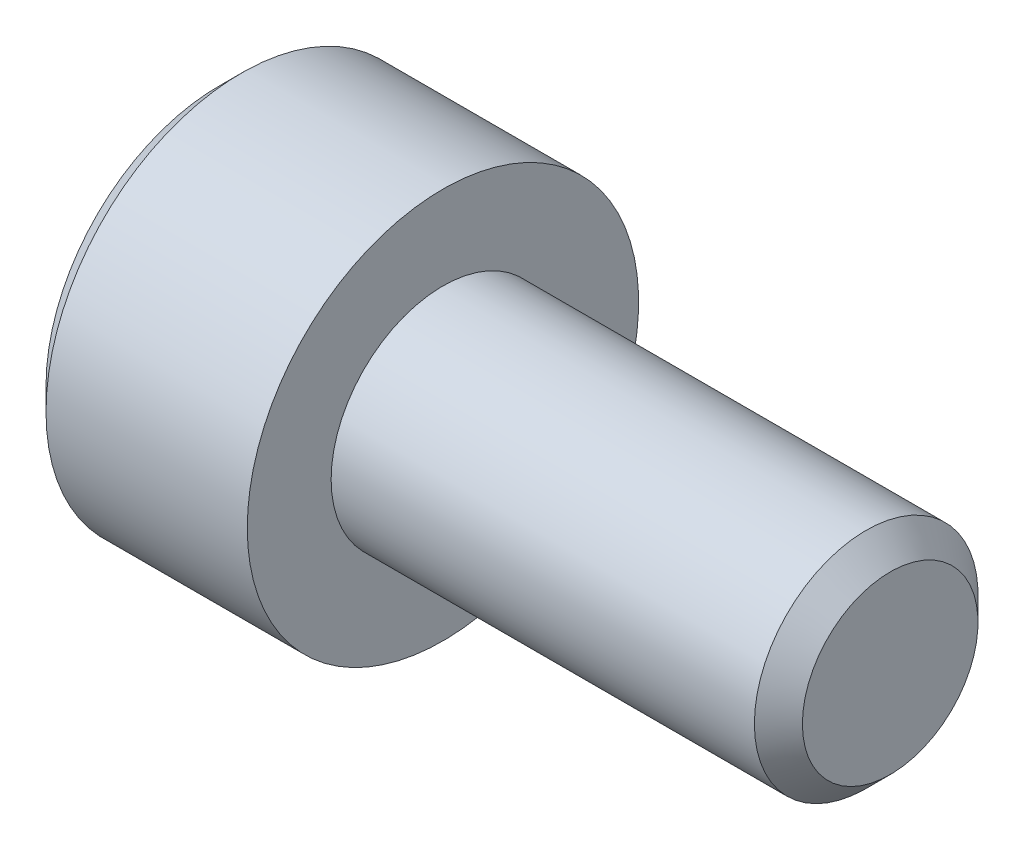
ISO-10303-21;
HEADER;
FILE_DESCRIPTION(('STEP AP214'),'2;1');
FILE_NAME('part.step','',(''),(''),'','','');
FILE_SCHEMA(('AUTOMOTIVE_DESIGN { 1 0 10303 214 1 1 1 1 }'));
ENDSEC;
DATA;
#1=APPLICATION_CONTEXT('core data for automotive mechanical design processes');
#2=APPLICATION_PROTOCOL_DEFINITION('international standard','automotive_design',2000,#1);
#3=PRODUCT_CONTEXT('',#1,'mechanical');
#4=PRODUCT('Part','Part','',(#3));
#5=PRODUCT_RELATED_PRODUCT_CATEGORY('part','',(#4));
#6=PRODUCT_DEFINITION_FORMATION('','',#4);
#7=PRODUCT_DEFINITION_CONTEXT('part definition',#1,'design');
#8=PRODUCT_DEFINITION('design','',#6,#7);
#9=PRODUCT_DEFINITION_SHAPE('','',#8);
#10=(LENGTH_UNIT() NAMED_UNIT(*) SI_UNIT(.MILLI.,.METRE.));
#11=(NAMED_UNIT(*) PLANE_ANGLE_UNIT() SI_UNIT($,.RADIAN.));
#12=(NAMED_UNIT(*) SI_UNIT($,.STERADIAN.) SOLID_ANGLE_UNIT());
#13=UNCERTAINTY_MEASURE_WITH_UNIT(LENGTH_MEASURE(1.E-05),#10,'distance_accuracy_value','');
#14=(GEOMETRIC_REPRESENTATION_CONTEXT(3) GLOBAL_UNCERTAINTY_ASSIGNED_CONTEXT((#13)) GLOBAL_UNIT_ASSIGNED_CONTEXT((#10,
#11,#12)) REPRESENTATION_CONTEXT('',''));
#15=CARTESIAN_POINT('',(0.,0.,0.));
#16=DIRECTION('',(0.,0.,1.));
#17=DIRECTION('',(1.,0.,0.));
#18=AXIS2_PLACEMENT_3D('',#15,#16,#17);
#19=CARTESIAN_POINT('',(-4.,-3.10000000000001,0.));
#20=DIRECTION('',(-1.,0.,0.));
#21=DIRECTION('',(0.,0.,1.));
#22=AXIS2_PLACEMENT_3D('',#19,#20,#21);
#23=PLANE('',#22);
#24=DIRECTION('',(0.,0.5,-0.866025403784439));
#25=VECTOR('',#24,1.);
#26=CARTESIAN_POINT('',(-4.,0.866025403784439,1.5));
#27=LINE('',#26,#25);
#28=CARTESIAN_POINT('',(-4.,0.866025403784439,1.5));
#29=VERTEX_POINT('',#28);
#30=CARTESIAN_POINT('',(-4.,1.73205080756888,0.));
#31=VERTEX_POINT('',#30);
#32=EDGE_CURVE('E59',#29,#31,#27,.T.);
#33=ORIENTED_EDGE('',*,*,#32,.F.);
#34=DIRECTION('',(0.,1.,0.));
#35=VECTOR('',#34,1.);
#36=CARTESIAN_POINT('',(-4.,-0.86602540378444,1.5));
#37=LINE('',#36,#35);
#38=CARTESIAN_POINT('',(-4.,-0.86602540378444,1.5));
#39=VERTEX_POINT('',#38);
#40=EDGE_CURVE('E142',#39,#29,#37,.T.);
#41=ORIENTED_EDGE('',*,*,#40,.F.);
#42=DIRECTION('',(0.,0.5,0.866025403784439));
#43=VECTOR('',#42,1.);
#44=CARTESIAN_POINT('',(-4.,-1.73205080756888,0.));
#45=LINE('',#44,#43);
#46=CARTESIAN_POINT('',(-4.,-1.73205080756888,0.));
#47=VERTEX_POINT('',#46);
#48=EDGE_CURVE('E140',#47,#39,#45,.T.);
#49=ORIENTED_EDGE('',*,*,#48,.F.);
#50=DIRECTION('',(0.,-0.5,0.866025403784439));
#51=VECTOR('',#50,1.);
#52=CARTESIAN_POINT('',(-4.,-0.866025403784439,-1.5));
#53=LINE('',#52,#51);
#54=CARTESIAN_POINT('',(-4.,-0.866025403784439,-1.5));
#55=VERTEX_POINT('',#54);
#56=EDGE_CURVE('E107',#55,#47,#53,.T.);
#57=ORIENTED_EDGE('',*,*,#56,.F.);
#58=DIRECTION('',(0.,-1.,0.));
#59=VECTOR('',#58,1.);
#60=CARTESIAN_POINT('',(-4.,0.866025403784439,-1.5));
#61=LINE('',#60,#59);
#62=CARTESIAN_POINT('',(-4.,0.866025403784439,-1.5));
#63=VERTEX_POINT('',#62);
#64=EDGE_CURVE('E136',#63,#55,#61,.T.);
#65=ORIENTED_EDGE('',*,*,#64,.F.);
#66=DIRECTION('',(0.,-0.5,-0.866025403784439));
#67=VECTOR('',#66,1.);
#68=CARTESIAN_POINT('',(-4.,1.73205080756888,0.));
#69=LINE('',#68,#67);
#70=EDGE_CURVE('E133',#31,#63,#69,.T.);
#71=ORIENTED_EDGE('',*,*,#70,.F.);
#72=EDGE_LOOP('',(#33,#41,#49,#57,#65,#71));
#73=FACE_BOUND('',#72,.T.);
#74=CARTESIAN_POINT('',(-4.,0.,0.));
#75=DIRECTION('',(-1.,0.,0.));
#76=DIRECTION('',(0.,0.,1.));
#77=AXIS2_PLACEMENT_3D('',#74,#75,#76);
#78=CIRCLE('',#77,3.10000000000001);
#79=CARTESIAN_POINT('',(-4.,0.,3.10000000000001));
#80=VERTEX_POINT('',#79);
#81=EDGE_CURVE('E146',#80,#80,#78,.T.);
#82=ORIENTED_EDGE('',*,*,#81,.T.);
#83=EDGE_LOOP('',(#82));
#84=FACE_BOUND('',#83,.T.);
#85=ADVANCED_FACE('F45',(#73,#84),#23,.T.);
#86=CARTESIAN_POINT('',(8.,0.,0.));
#87=DIRECTION('',(1.,0.,0.));
#88=DIRECTION('',(0.,0.,-1.));
#89=AXIS2_PLACEMENT_3D('',#86,#87,#88);
#90=PLANE('',#89);
#91=CARTESIAN_POINT('',(8.,0.,0.));
#92=DIRECTION('',(-1.,0.,0.));
#93=DIRECTION('',(0.,0.,1.));
#94=AXIS2_PLACEMENT_3D('',#91,#92,#93);
#95=CIRCLE('',#94,1.5705);
#96=CARTESIAN_POINT('',(8.,0.,1.5705));
#97=VERTEX_POINT('',#96);
#98=EDGE_CURVE('E11',#97,#97,#95,.T.);
#99=ORIENTED_EDGE('',*,*,#98,.F.);
#100=EDGE_LOOP('',(#99));
#101=FACE_BOUND('',#100,.T.);
#102=ADVANCED_FACE('F170',(#101),#90,.T.);
#103=CARTESIAN_POINT('',(7.5705,0.,0.));
#104=DIRECTION('',(-1.,0.,0.));
#105=DIRECTION('',(0.,0.,1.));
#106=AXIS2_PLACEMENT_3D('',#103,#104,#105);
#107=CONICAL_SURFACE('',#106,2.,0.785398163397453);
#108=ORIENTED_EDGE('',*,*,#98,.T.);
#109=EDGE_LOOP('',(#108));
#110=FACE_BOUND('',#109,.T.);
#111=CARTESIAN_POINT('',(7.5705,0.,0.));
#112=DIRECTION('',(-1.,0.,0.));
#113=DIRECTION('',(0.,0.,1.));
#114=AXIS2_PLACEMENT_3D('',#111,#112,#113);
#115=CIRCLE('',#114,2.);
#116=CARTESIAN_POINT('',(7.5705,0.,2.));
#117=VERTEX_POINT('',#116);
#118=EDGE_CURVE('E52',#117,#117,#115,.T.);
#119=ORIENTED_EDGE('',*,*,#118,.F.);
#120=EDGE_LOOP('',(#119));
#121=FACE_BOUND('',#120,.T.);
#122=ADVANCED_FACE('F168',(#110,#121),#107,.T.);
#123=CARTESIAN_POINT('',(-4.6,0.,0.));
#124=DIRECTION('',(-1.,0.,0.));
#125=DIRECTION('',(0.,0.,1.));
#126=AXIS2_PLACEMENT_3D('',#123,#124,#125);
#127=CYLINDRICAL_SURFACE('',#126,2.);
#128=ORIENTED_EDGE('',*,*,#118,.T.);
#129=EDGE_LOOP('',(#128));
#130=FACE_BOUND('',#129,.T.);
#131=CARTESIAN_POINT('',(0.,0.,0.));
#132=DIRECTION('',(-1.,0.,0.));
#133=DIRECTION('',(0.,0.,1.));
#134=AXIS2_PLACEMENT_3D('',#131,#132,#133);
#135=CIRCLE('',#134,2.);
#136=CARTESIAN_POINT('',(0.,0.,2.));
#137=VERTEX_POINT('',#136);
#138=EDGE_CURVE('E160',#137,#137,#135,.T.);
#139=ORIENTED_EDGE('',*,*,#138,.F.);
#140=EDGE_LOOP('',(#139));
#141=FACE_BOUND('',#140,.T.);
#142=ADVANCED_FACE('F165',(#130,#141),#127,.T.);
#143=CARTESIAN_POINT('',(0.,-2.,0.));
#144=DIRECTION('',(1.,0.,0.));
#145=DIRECTION('',(0.,0.,-1.));
#146=AXIS2_PLACEMENT_3D('',#143,#144,#145);
#147=PLANE('',#146);
#148=ORIENTED_EDGE('',*,*,#138,.T.);
#149=EDGE_LOOP('',(#148));
#150=FACE_BOUND('',#149,.T.);
#151=CARTESIAN_POINT('',(0.,0.,0.));
#152=DIRECTION('',(-1.,0.,0.));
#153=DIRECTION('',(0.,0.,1.));
#154=AXIS2_PLACEMENT_3D('',#151,#152,#153);
#155=CIRCLE('',#154,3.5);
#156=CARTESIAN_POINT('',(0.,0.,3.5));
#157=VERTEX_POINT('',#156);
#158=EDGE_CURVE('E157',#157,#157,#155,.T.);
#159=ORIENTED_EDGE('',*,*,#158,.F.);
#160=EDGE_LOOP('',(#159));
#161=FACE_BOUND('',#160,.T.);
#162=ADVANCED_FACE('F178',(#150,#161),#147,.T.);
#163=CARTESIAN_POINT('',(-4.6,0.,0.));
#164=DIRECTION('',(-1.,0.,0.));
#165=DIRECTION('',(0.,0.,1.));
#166=AXIS2_PLACEMENT_3D('',#163,#164,#165);
#167=CYLINDRICAL_SURFACE('',#166,3.5);
#168=ORIENTED_EDGE('',*,*,#158,.T.);
#169=EDGE_LOOP('',(#168));
#170=FACE_BOUND('',#169,.T.);
#171=CARTESIAN_POINT('',(-3.6,0.,0.));
#172=DIRECTION('',(-1.,0.,0.));
#173=DIRECTION('',(0.,0.,1.));
#174=AXIS2_PLACEMENT_3D('',#171,#172,#173);
#175=CIRCLE('',#174,3.5);
#176=CARTESIAN_POINT('',(-3.6,0.,3.5));
#177=VERTEX_POINT('',#176);
#178=EDGE_CURVE('E154',#177,#177,#175,.T.);
#179=ORIENTED_EDGE('',*,*,#178,.F.);
#180=EDGE_LOOP('',(#179));
#181=FACE_BOUND('',#180,.T.);
#182=ADVANCED_FACE('F194',(#170,#181),#167,.T.);
#183=CARTESIAN_POINT('',(-4.,0.,0.));
#184=DIRECTION('',(1.,0.,0.));
#185=DIRECTION('',(0.,0.,-1.));
#186=AXIS2_PLACEMENT_3D('',#183,#184,#185);
#187=CONICAL_SURFACE('',#186,3.10000000000001,0.785398163397443);
#188=ORIENTED_EDGE('',*,*,#178,.T.);
#189=EDGE_LOOP('',(#188));
#190=FACE_BOUND('',#189,.T.);
#191=ORIENTED_EDGE('',*,*,#81,.F.);
#192=EDGE_LOOP('',(#191));
#193=FACE_BOUND('',#192,.T.);
#194=ADVANCED_FACE('F192',(#190,#193),#187,.T.);
#195=CARTESIAN_POINT('',(-2.,0.866025403784439,1.5));
#196=DIRECTION('',(0.,0.866025403784439,0.5));
#197=DIRECTION('',(0.,-0.5,0.866025403784439));
#198=AXIS2_PLACEMENT_3D('',#195,#196,#197);
#199=PLANE('',#198);
#200=ORIENTED_EDGE('',*,*,#32,.T.);
#201=DIRECTION('',(-1.,0.,0.));
#202=VECTOR('',#201,1.);
#203=CARTESIAN_POINT('',(-2.,1.73205080756888,0.));
#204=LINE('',#203,#202);
#205=CARTESIAN_POINT('',(-2.,1.73205080756888,0.));
#206=VERTEX_POINT('',#205);
#207=EDGE_CURVE('E89',#206,#31,#204,.T.);
#208=ORIENTED_EDGE('',*,*,#207,.F.);
#209=DIRECTION('',(0.,0.5,-0.866025403784439));
#210=VECTOR('',#209,1.);
#211=CARTESIAN_POINT('',(-2.,0.866025403784439,1.5));
#212=LINE('',#211,#210);
#213=CARTESIAN_POINT('',(-2.,0.866025403784439,1.5));
#214=VERTEX_POINT('',#213);
#215=EDGE_CURVE('E144',#214,#206,#212,.T.);
#216=ORIENTED_EDGE('',*,*,#215,.F.);
#217=DIRECTION('',(-1.,0.,0.));
#218=VECTOR('',#217,1.);
#219=CARTESIAN_POINT('',(-2.,0.866025403784439,1.5));
#220=LINE('',#219,#218);
#221=EDGE_CURVE('E67',#214,#29,#220,.T.);
#222=ORIENTED_EDGE('',*,*,#221,.T.);
#223=EDGE_LOOP('',(#200,#208,#216,#222));
#224=FACE_BOUND('',#223,.T.);
#225=ADVANCED_FACE('F193',(#224),#199,.F.);
#226=CARTESIAN_POINT('',(-2.,-0.86602540378444,1.5));
#227=DIRECTION('',(0.,0.,1.));
#228=DIRECTION('',(0.,-1.,0.));
#229=AXIS2_PLACEMENT_3D('',#226,#227,#228);
#230=PLANE('',#229);
#231=ORIENTED_EDGE('',*,*,#40,.T.);
#232=ORIENTED_EDGE('',*,*,#221,.F.);
#233=DIRECTION('',(0.,1.,0.));
#234=VECTOR('',#233,1.);
#235=CARTESIAN_POINT('',(-2.,-0.86602540378444,1.5));
#236=LINE('',#235,#234);
#237=CARTESIAN_POINT('',(-2.,-0.86602540378444,1.5));
#238=VERTEX_POINT('',#237);
#239=EDGE_CURVE('E119',#238,#214,#236,.T.);
#240=ORIENTED_EDGE('',*,*,#239,.F.);
#241=DIRECTION('',(-1.,0.,0.));
#242=VECTOR('',#241,1.);
#243=CARTESIAN_POINT('',(-2.,-0.86602540378444,1.5));
#244=LINE('',#243,#242);
#245=EDGE_CURVE('E111',#238,#39,#244,.T.);
#246=ORIENTED_EDGE('',*,*,#245,.T.);
#247=EDGE_LOOP('',(#231,#232,#240,#246));
#248=FACE_BOUND('',#247,.T.);
#249=ADVANCED_FACE('F200',(#248),#230,.F.);
#250=CARTESIAN_POINT('',(-2.,-1.73205080756888,0.));
#251=DIRECTION('',(0.,-0.866025403784439,0.5));
#252=DIRECTION('',(0.,-0.5,-0.866025403784439));
#253=AXIS2_PLACEMENT_3D('',#250,#251,#252);
#254=PLANE('',#253);
#255=ORIENTED_EDGE('',*,*,#48,.T.);
#256=ORIENTED_EDGE('',*,*,#245,.F.);
#257=DIRECTION('',(0.,0.5,0.866025403784439));
#258=VECTOR('',#257,1.);
#259=CARTESIAN_POINT('',(-2.,-1.73205080756888,0.));
#260=LINE('',#259,#258);
#261=CARTESIAN_POINT('',(-2.,-1.73205080756888,0.));
#262=VERTEX_POINT('',#261);
#263=EDGE_CURVE('E115',#262,#238,#260,.T.);
#264=ORIENTED_EDGE('',*,*,#263,.F.);
#265=DIRECTION('',(-1.,0.,0.));
#266=VECTOR('',#265,1.);
#267=CARTESIAN_POINT('',(-2.,-1.73205080756888,0.));
#268=LINE('',#267,#266);
#269=EDGE_CURVE('E100',#262,#47,#268,.T.);
#270=ORIENTED_EDGE('',*,*,#269,.T.);
#271=EDGE_LOOP('',(#255,#256,#264,#270));
#272=FACE_BOUND('',#271,.T.);
#273=ADVANCED_FACE('F116',(#272),#254,.F.);
#274=CARTESIAN_POINT('',(-2.,-0.866025403784439,-1.5));
#275=DIRECTION('',(0.,-0.866025403784439,-0.5));
#276=DIRECTION('',(0.,0.5,-0.866025403784439));
#277=AXIS2_PLACEMENT_3D('',#274,#275,#276);
#278=PLANE('',#277);
#279=ORIENTED_EDGE('',*,*,#56,.T.);
#280=ORIENTED_EDGE('',*,*,#269,.F.);
#281=DIRECTION('',(0.,-0.5,0.866025403784439));
#282=VECTOR('',#281,1.);
#283=CARTESIAN_POINT('',(-2.,-0.866025403784439,-1.5));
#284=LINE('',#283,#282);
#285=CARTESIAN_POINT('',(-2.,-0.866025403784439,-1.5));
#286=VERTEX_POINT('',#285);
#287=EDGE_CURVE('E104',#286,#262,#284,.T.);
#288=ORIENTED_EDGE('',*,*,#287,.F.);
#289=DIRECTION('',(-1.,0.,0.));
#290=VECTOR('',#289,1.);
#291=CARTESIAN_POINT('',(-2.,-0.866025403784439,-1.5));
#292=LINE('',#291,#290);
#293=EDGE_CURVE('E112',#286,#55,#292,.T.);
#294=ORIENTED_EDGE('',*,*,#293,.T.);
#295=EDGE_LOOP('',(#279,#280,#288,#294));
#296=FACE_BOUND('',#295,.T.);
#297=ADVANCED_FACE('F102',(#296),#278,.F.);
#298=CARTESIAN_POINT('',(-2.,0.866025403784439,-1.5));
#299=DIRECTION('',(0.,0.,-1.));
#300=DIRECTION('',(-1.,0.,0.));
#301=AXIS2_PLACEMENT_3D('',#298,#299,#300);
#302=PLANE('',#301);
#303=ORIENTED_EDGE('',*,*,#64,.T.);
#304=ORIENTED_EDGE('',*,*,#293,.F.);
#305=DIRECTION('',(0.,-1.,0.));
#306=VECTOR('',#305,1.);
#307=CARTESIAN_POINT('',(-2.,0.866025403784439,-1.5));
#308=LINE('',#307,#306);
#309=CARTESIAN_POINT('',(-2.,0.866025403784439,-1.5));
#310=VERTEX_POINT('',#309);
#311=EDGE_CURVE('E125',#310,#286,#308,.T.);
#312=ORIENTED_EDGE('',*,*,#311,.F.);
#313=DIRECTION('',(-1.,0.,0.));
#314=VECTOR('',#313,1.);
#315=CARTESIAN_POINT('',(-2.,0.866025403784439,-1.5));
#316=LINE('',#315,#314);
#317=EDGE_CURVE('E149',#310,#63,#316,.T.);
#318=ORIENTED_EDGE('',*,*,#317,.T.);
#319=EDGE_LOOP('',(#303,#304,#312,#318));
#320=FACE_BOUND('',#319,.T.);
#321=ADVANCED_FACE('F259',(#320),#302,.F.);
#322=CARTESIAN_POINT('',(-2.,1.73205080756888,0.));
#323=DIRECTION('',(0.,0.866025403784439,-0.5));
#324=DIRECTION('',(0.,0.5,0.866025403784439));
#325=AXIS2_PLACEMENT_3D('',#322,#323,#324);
#326=PLANE('',#325);
#327=ORIENTED_EDGE('',*,*,#70,.T.);
#328=ORIENTED_EDGE('',*,*,#317,.F.);
#329=DIRECTION('',(0.,-0.5,-0.866025403784439));
#330=VECTOR('',#329,1.);
#331=CARTESIAN_POINT('',(-2.,1.73205080756888,0.));
#332=LINE('',#331,#330);
#333=EDGE_CURVE('E127',#206,#310,#332,.T.);
#334=ORIENTED_EDGE('',*,*,#333,.F.);
#335=ORIENTED_EDGE('',*,*,#207,.T.);
#336=EDGE_LOOP('',(#327,#328,#334,#335));
#337=FACE_BOUND('',#336,.T.);
#338=ADVANCED_FACE('F268',(#337),#326,.F.);
#339=CARTESIAN_POINT('',(-2.,0.,0.));
#340=DIRECTION('',(-1.,0.,0.));
#341=DIRECTION('',(0.,0.,1.));
#342=AXIS2_PLACEMENT_3D('',#339,#340,#341);
#343=PLANE('',#342);
#344=ORIENTED_EDGE('',*,*,#215,.T.);
#345=ORIENTED_EDGE('',*,*,#333,.T.);
#346=ORIENTED_EDGE('',*,*,#311,.T.);
#347=ORIENTED_EDGE('',*,*,#287,.T.);
#348=ORIENTED_EDGE('',*,*,#263,.T.);
#349=ORIENTED_EDGE('',*,*,#239,.T.);
#350=EDGE_LOOP('',(#344,#345,#346,#347,#348,#349));
#351=FACE_BOUND('',#350,.T.);
#352=ADVANCED_FACE('F122',(#351),#343,.T.);
#353=CLOSED_SHELL('',(#85,#102,#122,#142,#162,#182,#194,#225,#249,#273,#297,#321,#338,#352));
#354=MANIFOLD_SOLID_BREP('B2',#353);
#355=ADVANCED_BREP_SHAPE_REPRESENTATION('',(#18,#354),#14);
#356=SHAPE_DEFINITION_REPRESENTATION(#9,#355);
ENDSEC;
END-ISO-10303-21;
